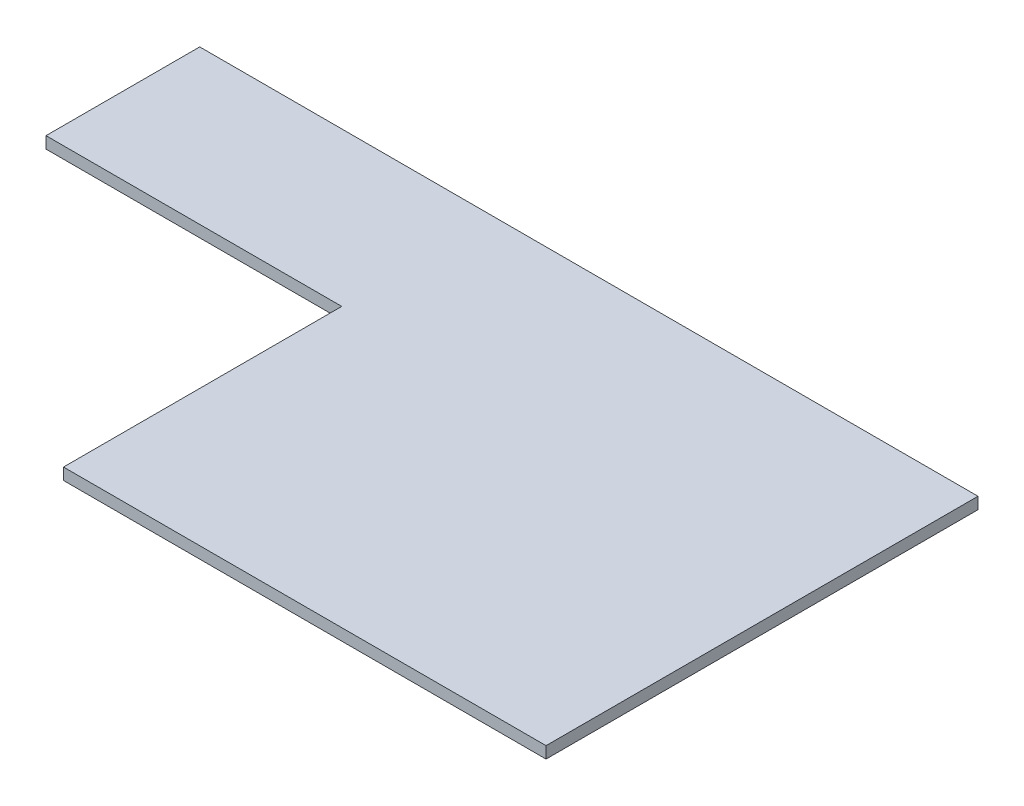
ISO-10303-21;
HEADER;
FILE_DESCRIPTION(('STEP AP214'),'2;1');
FILE_NAME('part.step','',(''),(''),'','','');
FILE_SCHEMA(('AUTOMOTIVE_DESIGN { 1 0 10303 214 1 1 1 1 }'));
ENDSEC;
DATA;
#1=APPLICATION_CONTEXT('core data for automotive mechanical design processes');
#2=APPLICATION_PROTOCOL_DEFINITION('international standard','automotive_design',2000,#1);
#3=PRODUCT_CONTEXT('',#1,'mechanical');
#4=PRODUCT('Part','Part','',(#3));
#5=PRODUCT_RELATED_PRODUCT_CATEGORY('part','',(#4));
#6=PRODUCT_DEFINITION_FORMATION('','',#4);
#7=PRODUCT_DEFINITION_CONTEXT('part definition',#1,'design');
#8=PRODUCT_DEFINITION('design','',#6,#7);
#9=PRODUCT_DEFINITION_SHAPE('','',#8);
#10=(LENGTH_UNIT() NAMED_UNIT(*) SI_UNIT(.MILLI.,.METRE.));
#11=(NAMED_UNIT(*) PLANE_ANGLE_UNIT() SI_UNIT($,.RADIAN.));
#12=(NAMED_UNIT(*) SI_UNIT($,.STERADIAN.) SOLID_ANGLE_UNIT());
#13=UNCERTAINTY_MEASURE_WITH_UNIT(LENGTH_MEASURE(1.E-05),#10,'distance_accuracy_value','');
#14=(GEOMETRIC_REPRESENTATION_CONTEXT(3) GLOBAL_UNCERTAINTY_ASSIGNED_CONTEXT((#13)) GLOBAL_UNIT_ASSIGNED_CONTEXT((#10,
#11,#12)) REPRESENTATION_CONTEXT('',''));
#15=CARTESIAN_POINT('',(0.,0.,0.));
#16=DIRECTION('',(0.,0.,1.));
#17=DIRECTION('',(1.,0.,0.));
#18=AXIS2_PLACEMENT_3D('',#15,#16,#17);
#19=CARTESIAN_POINT('',(0.,6.,0.));
#20=DIRECTION('',(-1.,0.,0.));
#21=DIRECTION('',(0.,0.,1.));
#22=AXIS2_PLACEMENT_3D('',#19,#20,#21);
#23=PLANE('',#22);
#24=DIRECTION('',(0.,0.,-1.));
#25=VECTOR('',#24,1.);
#26=CARTESIAN_POINT('',(0.,0.,0.));
#27=LINE('',#26,#25);
#28=CARTESIAN_POINT('',(0.,0.,0.));
#29=VERTEX_POINT('',#28);
#30=CARTESIAN_POINT('',(0.,0.,-222.));
#31=VERTEX_POINT('',#30);
#32=EDGE_CURVE('E120',#29,#31,#27,.T.);
#33=ORIENTED_EDGE('',*,*,#32,.T.);
#34=DIRECTION('',(0.,-1.,0.));
#35=VECTOR('',#34,1.);
#36=CARTESIAN_POINT('',(0.,6.,-222.));
#37=LINE('',#36,#35);
#38=CARTESIAN_POINT('',(0.,6.,-222.));
#39=VERTEX_POINT('',#38);
#40=EDGE_CURVE('E11',#39,#31,#37,.T.);
#41=ORIENTED_EDGE('',*,*,#40,.F.);
#42=DIRECTION('',(0.,0.,-1.));
#43=VECTOR('',#42,1.);
#44=CARTESIAN_POINT('',(0.,6.,0.));
#45=LINE('',#44,#43);
#46=CARTESIAN_POINT('',(0.,6.,0.));
#47=VERTEX_POINT('',#46);
#48=EDGE_CURVE('E130',#47,#39,#45,.T.);
#49=ORIENTED_EDGE('',*,*,#48,.F.);
#50=DIRECTION('',(0.,-1.,0.));
#51=VECTOR('',#50,1.);
#52=CARTESIAN_POINT('',(0.,6.,0.));
#53=LINE('',#52,#51);
#54=EDGE_CURVE('E116',#47,#29,#53,.T.);
#55=ORIENTED_EDGE('',*,*,#54,.T.);
#56=EDGE_LOOP('',(#33,#41,#49,#55));
#57=FACE_BOUND('',#56,.T.);
#58=ADVANCED_FACE('F36',(#57),#23,.F.);
#59=CARTESIAN_POINT('',(0.,6.,-222.));
#60=DIRECTION('',(0.,0.,1.));
#61=DIRECTION('',(1.,0.,0.));
#62=AXIS2_PLACEMENT_3D('',#59,#60,#61);
#63=PLANE('',#62);
#64=DIRECTION('',(-1.,0.,0.));
#65=VECTOR('',#64,1.);
#66=CARTESIAN_POINT('',(0.,0.,-222.));
#67=LINE('',#66,#65);
#68=CARTESIAN_POINT('',(-400.,0.,-222.));
#69=VERTEX_POINT('',#68);
#70=EDGE_CURVE('E123',#31,#69,#67,.T.);
#71=ORIENTED_EDGE('',*,*,#70,.T.);
#72=DIRECTION('',(0.,-1.,0.));
#73=VECTOR('',#72,1.);
#74=CARTESIAN_POINT('',(-400.,6.,-222.));
#75=LINE('',#74,#73);
#76=CARTESIAN_POINT('',(-400.,6.,-222.));
#77=VERTEX_POINT('',#76);
#78=EDGE_CURVE('E44',#77,#69,#75,.T.);
#79=ORIENTED_EDGE('',*,*,#78,.F.);
#80=DIRECTION('',(-1.,0.,0.));
#81=VECTOR('',#80,1.);
#82=CARTESIAN_POINT('',(0.,6.,-222.));
#83=LINE('',#82,#81);
#84=EDGE_CURVE('E89',#39,#77,#83,.T.);
#85=ORIENTED_EDGE('',*,*,#84,.F.);
#86=ORIENTED_EDGE('',*,*,#40,.T.);
#87=EDGE_LOOP('',(#71,#79,#85,#86));
#88=FACE_BOUND('',#87,.T.);
#89=ADVANCED_FACE('F154',(#88),#63,.F.);
#90=CARTESIAN_POINT('',(-400.,6.,-143.));
#91=DIRECTION('',(1.,0.,0.));
#92=DIRECTION('',(0.,0.,-1.));
#93=AXIS2_PLACEMENT_3D('',#90,#91,#92);
#94=PLANE('',#93);
#95=DIRECTION('',(0.,0.,1.));
#96=VECTOR('',#95,1.);
#97=CARTESIAN_POINT('',(-400.,0.,-143.));
#98=LINE('',#97,#96);
#99=CARTESIAN_POINT('',(-400.,0.,-143.));
#100=VERTEX_POINT('',#99);
#101=EDGE_CURVE('E125',#69,#100,#98,.T.);
#102=ORIENTED_EDGE('',*,*,#101,.T.);
#103=DIRECTION('',(0.,-1.,0.));
#104=VECTOR('',#103,1.);
#105=CARTESIAN_POINT('',(-400.,6.,-143.));
#106=LINE('',#105,#104);
#107=CARTESIAN_POINT('',(-400.,6.,-143.));
#108=VERTEX_POINT('',#107);
#109=EDGE_CURVE('E111',#108,#100,#106,.T.);
#110=ORIENTED_EDGE('',*,*,#109,.F.);
#111=DIRECTION('',(0.,0.,1.));
#112=VECTOR('',#111,1.);
#113=CARTESIAN_POINT('',(-400.,6.,-143.));
#114=LINE('',#113,#112);
#115=EDGE_CURVE('E102',#77,#108,#114,.T.);
#116=ORIENTED_EDGE('',*,*,#115,.F.);
#117=ORIENTED_EDGE('',*,*,#78,.T.);
#118=EDGE_LOOP('',(#102,#110,#116,#117));
#119=FACE_BOUND('',#118,.T.);
#120=ADVANCED_FACE('F136',(#119),#94,.F.);
#121=CARTESIAN_POINT('',(-400.,6.,-143.));
#122=DIRECTION('',(0.,0.,-1.));
#123=DIRECTION('',(-1.,0.,0.));
#124=AXIS2_PLACEMENT_3D('',#121,#122,#123);
#125=PLANE('',#124);
#126=DIRECTION('',(1.,0.,0.));
#127=VECTOR('',#126,1.);
#128=CARTESIAN_POINT('',(-400.,0.,-143.));
#129=LINE('',#128,#127);
#130=CARTESIAN_POINT('',(-248.,0.,-143.));
#131=VERTEX_POINT('',#130);
#132=EDGE_CURVE('E110',#100,#131,#129,.T.);
#133=ORIENTED_EDGE('',*,*,#132,.T.);
#134=DIRECTION('',(0.,-1.,0.));
#135=VECTOR('',#134,1.);
#136=CARTESIAN_POINT('',(-248.,6.,-143.));
#137=LINE('',#136,#135);
#138=CARTESIAN_POINT('',(-248.,6.,-143.));
#139=VERTEX_POINT('',#138);
#140=EDGE_CURVE('E107',#139,#131,#137,.T.);
#141=ORIENTED_EDGE('',*,*,#140,.F.);
#142=DIRECTION('',(1.,0.,0.));
#143=VECTOR('',#142,1.);
#144=CARTESIAN_POINT('',(-400.,6.,-143.));
#145=LINE('',#144,#143);
#146=EDGE_CURVE('E96',#108,#139,#145,.T.);
#147=ORIENTED_EDGE('',*,*,#146,.F.);
#148=ORIENTED_EDGE('',*,*,#109,.T.);
#149=EDGE_LOOP('',(#133,#141,#147,#148));
#150=FACE_BOUND('',#149,.T.);
#151=ADVANCED_FACE('F108',(#150),#125,.F.);
#152=CARTESIAN_POINT('',(-248.,6.,0.));
#153=DIRECTION('',(1.,0.,0.));
#154=DIRECTION('',(0.,0.,-1.));
#155=AXIS2_PLACEMENT_3D('',#152,#153,#154);
#156=PLANE('',#155);
#157=DIRECTION('',(0.,0.,1.));
#158=VECTOR('',#157,1.);
#159=CARTESIAN_POINT('',(-248.,0.,0.));
#160=LINE('',#159,#158);
#161=CARTESIAN_POINT('',(-248.,0.,0.));
#162=VERTEX_POINT('',#161);
#163=EDGE_CURVE('E75',#131,#162,#160,.T.);
#164=ORIENTED_EDGE('',*,*,#163,.T.);
#165=DIRECTION('',(0.,-1.,0.));
#166=VECTOR('',#165,1.);
#167=CARTESIAN_POINT('',(-248.,6.,0.));
#168=LINE('',#167,#166);
#169=CARTESIAN_POINT('',(-248.,6.,0.));
#170=VERTEX_POINT('',#169);
#171=EDGE_CURVE('E112',#170,#162,#168,.T.);
#172=ORIENTED_EDGE('',*,*,#171,.F.);
#173=DIRECTION('',(0.,0.,1.));
#174=VECTOR('',#173,1.);
#175=CARTESIAN_POINT('',(-248.,6.,0.));
#176=LINE('',#175,#174);
#177=EDGE_CURVE('E100',#139,#170,#176,.T.);
#178=ORIENTED_EDGE('',*,*,#177,.F.);
#179=ORIENTED_EDGE('',*,*,#140,.T.);
#180=EDGE_LOOP('',(#164,#172,#178,#179));
#181=FACE_BOUND('',#180,.T.);
#182=ADVANCED_FACE('F114',(#181),#156,.F.);
#183=CARTESIAN_POINT('',(0.,6.,0.));
#184=DIRECTION('',(0.,0.,-1.));
#185=DIRECTION('',(-1.,0.,0.));
#186=AXIS2_PLACEMENT_3D('',#183,#184,#185);
#187=PLANE('',#186);
#188=DIRECTION('',(1.,0.,0.));
#189=VECTOR('',#188,1.);
#190=CARTESIAN_POINT('',(0.,0.,0.));
#191=LINE('',#190,#189);
#192=EDGE_CURVE('E81',#162,#29,#191,.T.);
#193=ORIENTED_EDGE('',*,*,#192,.T.);
#194=ORIENTED_EDGE('',*,*,#54,.F.);
#195=DIRECTION('',(1.,0.,0.));
#196=VECTOR('',#195,1.);
#197=CARTESIAN_POINT('',(0.,6.,0.));
#198=LINE('',#197,#196);
#199=EDGE_CURVE('E52',#170,#47,#198,.T.);
#200=ORIENTED_EDGE('',*,*,#199,.F.);
#201=ORIENTED_EDGE('',*,*,#171,.T.);
#202=EDGE_LOOP('',(#193,#194,#200,#201));
#203=FACE_BOUND('',#202,.T.);
#204=ADVANCED_FACE('F143',(#203),#187,.F.);
#205=CARTESIAN_POINT('',(0.,6.,0.));
#206=DIRECTION('',(0.,1.,0.));
#207=DIRECTION('',(0.,0.,1.));
#208=AXIS2_PLACEMENT_3D('',#205,#206,#207);
#209=PLANE('',#208);
#210=ORIENTED_EDGE('',*,*,#48,.T.);
#211=ORIENTED_EDGE('',*,*,#84,.T.);
#212=ORIENTED_EDGE('',*,*,#115,.T.);
#213=ORIENTED_EDGE('',*,*,#146,.T.);
#214=ORIENTED_EDGE('',*,*,#177,.T.);
#215=ORIENTED_EDGE('',*,*,#199,.T.);
#216=EDGE_LOOP('',(#210,#211,#212,#213,#214,#215));
#217=FACE_BOUND('',#216,.T.);
#218=ADVANCED_FACE('F98',(#217),#209,.T.);
#219=CARTESIAN_POINT('',(0.,0.,0.));
#220=DIRECTION('',(0.,1.,0.));
#221=DIRECTION('',(0.,0.,1.));
#222=AXIS2_PLACEMENT_3D('',#219,#220,#221);
#223=PLANE('',#222);
#224=ORIENTED_EDGE('',*,*,#32,.F.);
#225=ORIENTED_EDGE('',*,*,#192,.F.);
#226=ORIENTED_EDGE('',*,*,#163,.F.);
#227=ORIENTED_EDGE('',*,*,#132,.F.);
#228=ORIENTED_EDGE('',*,*,#101,.F.);
#229=ORIENTED_EDGE('',*,*,#70,.F.);
#230=EDGE_LOOP('',(#224,#225,#226,#227,#228,#229));
#231=FACE_BOUND('',#230,.T.);
#232=ADVANCED_FACE('F139',(#231),#223,.F.);
#233=CLOSED_SHELL('',(#58,#89,#120,#151,#182,#204,#218,#232));
#234=MANIFOLD_SOLID_BREP('B2',#233);
#235=ADVANCED_BREP_SHAPE_REPRESENTATION('',(#18,#234),#14);
#236=SHAPE_DEFINITION_REPRESENTATION(#9,#235);
ENDSEC;
END-ISO-10303-21;
